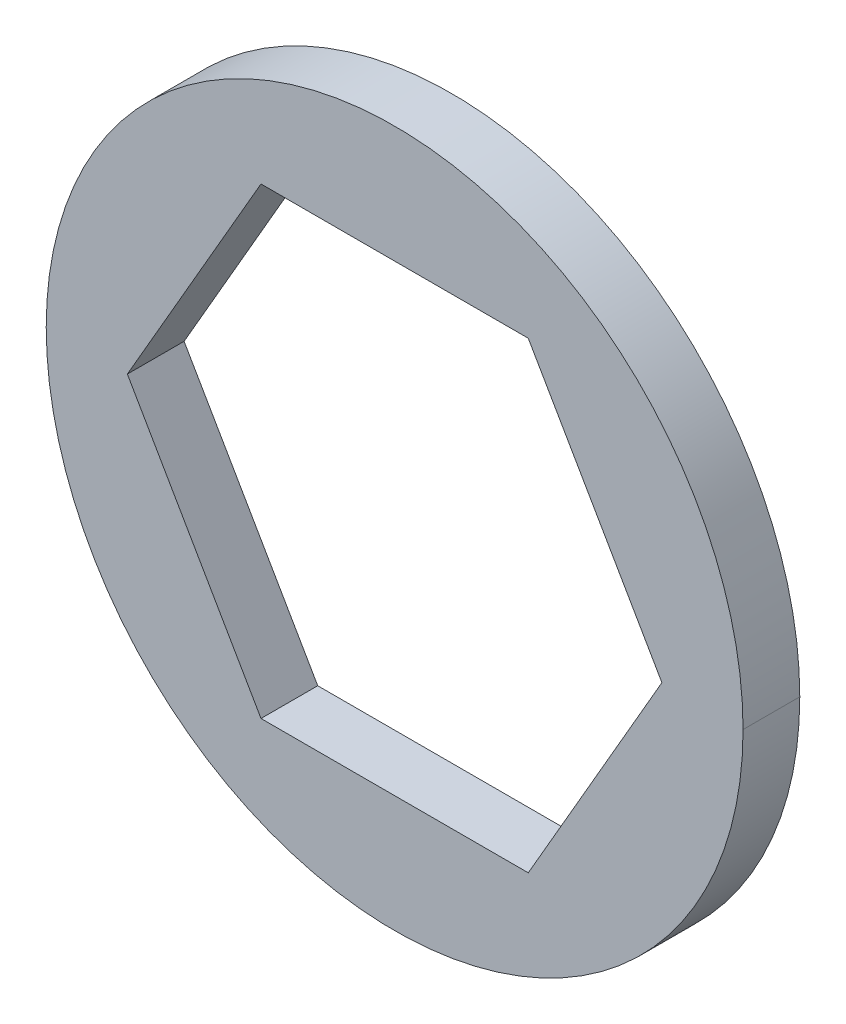
ISO-10303-21;
HEADER;
FILE_DESCRIPTION(('STEP AP214'),'2;1');
FILE_NAME('part.step','',(''),(''),'','','');
FILE_SCHEMA(('AUTOMOTIVE_DESIGN { 1 0 10303 214 1 1 1 1 }'));
ENDSEC;
DATA;
#1=APPLICATION_CONTEXT('core data for automotive mechanical design processes');
#2=APPLICATION_PROTOCOL_DEFINITION('international standard','automotive_design',2000,#1);
#3=PRODUCT_CONTEXT('',#1,'mechanical');
#4=PRODUCT('Part','Part','',(#3));
#5=PRODUCT_RELATED_PRODUCT_CATEGORY('part','',(#4));
#6=PRODUCT_DEFINITION_FORMATION('','',#4);
#7=PRODUCT_DEFINITION_CONTEXT('part definition',#1,'design');
#8=PRODUCT_DEFINITION('design','',#6,#7);
#9=PRODUCT_DEFINITION_SHAPE('','',#8);
#10=(LENGTH_UNIT() NAMED_UNIT(*) SI_UNIT(.MILLI.,.METRE.));
#11=(NAMED_UNIT(*) PLANE_ANGLE_UNIT() SI_UNIT($,.RADIAN.));
#12=(NAMED_UNIT(*) SI_UNIT($,.STERADIAN.) SOLID_ANGLE_UNIT());
#13=UNCERTAINTY_MEASURE_WITH_UNIT(LENGTH_MEASURE(1.E-05),#10,'distance_accuracy_value','');
#14=(GEOMETRIC_REPRESENTATION_CONTEXT(3) GLOBAL_UNCERTAINTY_ASSIGNED_CONTEXT((#13)) GLOBAL_UNIT_ASSIGNED_CONTEXT((#10,
#11,#12)) REPRESENTATION_CONTEXT('',''));
#15=CARTESIAN_POINT('',(0.,0.,0.));
#16=DIRECTION('',(0.,0.,1.));
#17=DIRECTION('',(1.,0.,0.));
#18=AXIS2_PLACEMENT_3D('',#15,#16,#17);
#19=CARTESIAN_POINT('',(-7.47899538708241,0.,0.79375));
#20=DIRECTION('',(0.866025403784439,0.5,0.));
#21=DIRECTION('',(0.,0.,-1.));
#22=AXIS2_PLACEMENT_3D('',#19,#20,#21);
#23=PLANE('',#22);
#24=DIRECTION('',(0.5,-0.866025403784439,0.));
#25=VECTOR('',#24,1.);
#26=CARTESIAN_POINT('',(-7.47899538708241,0.,-0.79375));
#27=LINE('',#26,#25);
#28=CARTESIAN_POINT('',(-7.47899538708241,0.,-0.79375));
#29=VERTEX_POINT('',#28);
#30=CARTESIAN_POINT('',(-3.7394976935412,-6.477,-0.79375));
#31=VERTEX_POINT('',#30);
#32=EDGE_CURVE('E139',#29,#31,#27,.T.);
#33=ORIENTED_EDGE('',*,*,#32,.F.);
#34=DIRECTION('',(0.,0.,-1.));
#35=VECTOR('',#34,1.);
#36=CARTESIAN_POINT('',(-7.47899538708241,0.,0.79375));
#37=LINE('',#36,#35);
#38=CARTESIAN_POINT('',(-7.47899538708242,0.,0.79375));
#39=VERTEX_POINT('',#38);
#40=EDGE_CURVE('E11',#39,#29,#37,.T.);
#41=ORIENTED_EDGE('',*,*,#40,.F.);
#42=DIRECTION('',(0.5,-0.866025403784439,0.));
#43=VECTOR('',#42,1.);
#44=CARTESIAN_POINT('',(-7.47899538708241,0.,0.79375));
#45=LINE('',#44,#43);
#46=CARTESIAN_POINT('',(-3.7394976935412,-6.477,0.79375));
#47=VERTEX_POINT('',#46);
#48=EDGE_CURVE('E129',#39,#47,#45,.T.);
#49=ORIENTED_EDGE('',*,*,#48,.T.);
#50=DIRECTION('',(0.,0.,-1.));
#51=VECTOR('',#50,1.);
#52=CARTESIAN_POINT('',(-3.7394976935412,-6.477,0.79375));
#53=LINE('',#52,#51);
#54=EDGE_CURVE('E136',#47,#31,#53,.T.);
#55=ORIENTED_EDGE('',*,*,#54,.T.);
#56=EDGE_LOOP('',(#33,#41,#49,#55));
#57=FACE_BOUND('',#56,.T.);
#58=ADVANCED_FACE('F16',(#57),#23,.T.);
#59=CARTESIAN_POINT('',(-3.73949769354121,6.477,0.79375));
#60=DIRECTION('',(0.866025403784439,-0.5,0.));
#61=DIRECTION('',(0.,0.,-1.));
#62=AXIS2_PLACEMENT_3D('',#59,#60,#61);
#63=PLANE('',#62);
#64=DIRECTION('',(-0.5,-0.866025403784439,0.));
#65=VECTOR('',#64,1.);
#66=CARTESIAN_POINT('',(-3.73949769354121,6.477,-0.79375));
#67=LINE('',#66,#65);
#68=CARTESIAN_POINT('',(-3.73949769354121,6.477,-0.79375));
#69=VERTEX_POINT('',#68);
#70=EDGE_CURVE('E150',#69,#29,#67,.T.);
#71=ORIENTED_EDGE('',*,*,#70,.F.);
#72=DIRECTION('',(0.,0.,-1.));
#73=VECTOR('',#72,1.);
#74=CARTESIAN_POINT('',(-3.73949769354121,6.477,0.79375));
#75=LINE('',#74,#73);
#76=CARTESIAN_POINT('',(-3.73949769354121,6.477,0.79375));
#77=VERTEX_POINT('',#76);
#78=EDGE_CURVE('E27',#77,#69,#75,.T.);
#79=ORIENTED_EDGE('',*,*,#78,.F.);
#80=DIRECTION('',(-0.5,-0.866025403784439,0.));
#81=VECTOR('',#80,1.);
#82=CARTESIAN_POINT('',(-3.73949769354121,6.477,0.79375));
#83=LINE('',#82,#81);
#84=EDGE_CURVE('E154',#77,#39,#83,.T.);
#85=ORIENTED_EDGE('',*,*,#84,.T.);
#86=ORIENTED_EDGE('',*,*,#40,.T.);
#87=EDGE_LOOP('',(#71,#79,#85,#86));
#88=FACE_BOUND('',#87,.T.);
#89=ADVANCED_FACE('F295',(#88),#63,.T.);
#90=CARTESIAN_POINT('',(3.7394976935412,6.477,0.79375));
#91=DIRECTION('',(0.,-1.,0.));
#92=DIRECTION('',(0.,0.,-1.));
#93=AXIS2_PLACEMENT_3D('',#90,#91,#92);
#94=PLANE('',#93);
#95=DIRECTION('',(-1.,0.,0.));
#96=VECTOR('',#95,1.);
#97=CARTESIAN_POINT('',(3.7394976935412,6.477,-0.79375));
#98=LINE('',#97,#96);
#99=CARTESIAN_POINT('',(3.7394976935412,6.477,-0.79375));
#100=VERTEX_POINT('',#99);
#101=EDGE_CURVE('E142',#100,#69,#98,.T.);
#102=ORIENTED_EDGE('',*,*,#101,.F.);
#103=DIRECTION('',(0.,0.,-1.));
#104=VECTOR('',#103,1.);
#105=CARTESIAN_POINT('',(3.7394976935412,6.477,0.79375));
#106=LINE('',#105,#104);
#107=CARTESIAN_POINT('',(3.7394976935412,6.477,0.79375));
#108=VERTEX_POINT('',#107);
#109=EDGE_CURVE('E107',#108,#100,#106,.T.);
#110=ORIENTED_EDGE('',*,*,#109,.F.);
#111=DIRECTION('',(-1.,0.,0.));
#112=VECTOR('',#111,1.);
#113=CARTESIAN_POINT('',(3.7394976935412,6.477,0.79375));
#114=LINE('',#113,#112);
#115=EDGE_CURVE('E116',#108,#77,#114,.T.);
#116=ORIENTED_EDGE('',*,*,#115,.T.);
#117=ORIENTED_EDGE('',*,*,#78,.T.);
#118=EDGE_LOOP('',(#102,#110,#116,#117));
#119=FACE_BOUND('',#118,.T.);
#120=ADVANCED_FACE('F178',(#119),#94,.T.);
#121=CARTESIAN_POINT('',(7.47899538708241,0.,0.79375));
#122=DIRECTION('',(-0.866025403784439,-0.5,0.));
#123=DIRECTION('',(-0.5,0.866025403784439,0.));
#124=AXIS2_PLACEMENT_3D('',#121,#122,#123);
#125=PLANE('',#124);
#126=DIRECTION('',(-0.5,0.866025403784439,0.));
#127=VECTOR('',#126,1.);
#128=CARTESIAN_POINT('',(7.47899538708241,0.,-0.79375));
#129=LINE('',#128,#127);
#130=CARTESIAN_POINT('',(7.47899538708241,0.,-0.79375));
#131=VERTEX_POINT('',#130);
#132=EDGE_CURVE('E104',#131,#100,#129,.T.);
#133=ORIENTED_EDGE('',*,*,#132,.F.);
#134=DIRECTION('',(0.,0.,-1.));
#135=VECTOR('',#134,1.);
#136=CARTESIAN_POINT('',(7.47899538708241,0.,0.79375));
#137=LINE('',#136,#135);
#138=CARTESIAN_POINT('',(7.47899538708241,0.,0.79375));
#139=VERTEX_POINT('',#138);
#140=EDGE_CURVE('E98',#139,#131,#137,.T.);
#141=ORIENTED_EDGE('',*,*,#140,.F.);
#142=DIRECTION('',(-0.5,0.866025403784439,0.));
#143=VECTOR('',#142,1.);
#144=CARTESIAN_POINT('',(7.47899538708241,0.,0.79375));
#145=LINE('',#144,#143);
#146=EDGE_CURVE('E20',#139,#108,#145,.T.);
#147=ORIENTED_EDGE('',*,*,#146,.T.);
#148=ORIENTED_EDGE('',*,*,#109,.T.);
#149=EDGE_LOOP('',(#133,#141,#147,#148));
#150=FACE_BOUND('',#149,.T.);
#151=ADVANCED_FACE('F100',(#150),#125,.T.);
#152=CARTESIAN_POINT('',(3.73949769354121,-6.477,0.79375));
#153=DIRECTION('',(-0.866025403784439,0.5,0.));
#154=DIRECTION('',(0.,0.,1.));
#155=AXIS2_PLACEMENT_3D('',#152,#153,#154);
#156=PLANE('',#155);
#157=DIRECTION('',(0.5,0.866025403784439,0.));
#158=VECTOR('',#157,1.);
#159=CARTESIAN_POINT('',(3.73949769354121,-6.477,-0.79375));
#160=LINE('',#159,#158);
#161=CARTESIAN_POINT('',(3.73949769354121,-6.477,-0.79375));
#162=VERTEX_POINT('',#161);
#163=EDGE_CURVE('E143',#162,#131,#160,.T.);
#164=ORIENTED_EDGE('',*,*,#163,.F.);
#165=DIRECTION('',(0.,0.,-1.));
#166=VECTOR('',#165,1.);
#167=CARTESIAN_POINT('',(3.73949769354121,-6.477,0.79375));
#168=LINE('',#167,#166);
#169=CARTESIAN_POINT('',(3.73949769354121,-6.477,0.79375));
#170=VERTEX_POINT('',#169);
#171=EDGE_CURVE('E89',#170,#162,#168,.T.);
#172=ORIENTED_EDGE('',*,*,#171,.F.);
#173=DIRECTION('',(0.5,0.866025403784439,0.));
#174=VECTOR('',#173,1.);
#175=CARTESIAN_POINT('',(3.73949769354121,-6.477,0.79375));
#176=LINE('',#175,#174);
#177=EDGE_CURVE('E113',#170,#139,#176,.T.);
#178=ORIENTED_EDGE('',*,*,#177,.T.);
#179=ORIENTED_EDGE('',*,*,#140,.T.);
#180=EDGE_LOOP('',(#164,#172,#178,#179));
#181=FACE_BOUND('',#180,.T.);
#182=ADVANCED_FACE('F119',(#181),#156,.T.);
#183=CARTESIAN_POINT('',(-3.7394976935412,-6.477,0.79375));
#184=DIRECTION('',(0.,1.,0.));
#185=DIRECTION('',(1.,0.,0.));
#186=AXIS2_PLACEMENT_3D('',#183,#184,#185);
#187=PLANE('',#186);
#188=DIRECTION('',(1.,0.,0.));
#189=VECTOR('',#188,1.);
#190=CARTESIAN_POINT('',(-3.7394976935412,-6.477,-0.79375));
#191=LINE('',#190,#189);
#192=EDGE_CURVE('E146',#31,#162,#191,.T.);
#193=ORIENTED_EDGE('',*,*,#192,.F.);
#194=ORIENTED_EDGE('',*,*,#54,.F.);
#195=DIRECTION('',(1.,0.,0.));
#196=VECTOR('',#195,1.);
#197=CARTESIAN_POINT('',(-3.7394976935412,-6.477,0.79375));
#198=LINE('',#197,#196);
#199=EDGE_CURVE('E121',#47,#170,#198,.T.);
#200=ORIENTED_EDGE('',*,*,#199,.T.);
#201=ORIENTED_EDGE('',*,*,#171,.T.);
#202=EDGE_LOOP('',(#193,#194,#200,#201));
#203=FACE_BOUND('',#202,.T.);
#204=ADVANCED_FACE('F307',(#203),#187,.T.);
#205=CARTESIAN_POINT('',(0.,0.,0.79375));
#206=DIRECTION('',(0.,0.,-1.));
#207=DIRECTION('',(-1.,0.,0.));
#208=AXIS2_PLACEMENT_3D('',#205,#206,#207);
#209=CYLINDRICAL_SURFACE('',#208,9.75);
#210=DIRECTION('',(0.,0.,-1.));
#211=VECTOR('',#210,1.);
#212=CARTESIAN_POINT('',(9.75,0.,0.79375));
#213=LINE('',#212,#211);
#214=CARTESIAN_POINT('',(9.75,0.,0.79375));
#215=VERTEX_POINT('',#214);
#216=CARTESIAN_POINT('',(9.75,0.,-0.79375));
#217=VERTEX_POINT('',#216);
#218=EDGE_CURVE('E162',#215,#217,#213,.T.);
#219=ORIENTED_EDGE('',*,*,#218,.F.);
#220=CARTESIAN_POINT('',(0.,0.,0.79375));
#221=DIRECTION('',(0.,0.,1.));
#222=DIRECTION('',(1.,0.,0.));
#223=AXIS2_PLACEMENT_3D('',#220,#221,#222);
#224=CIRCLE('',#223,9.75);
#225=CARTESIAN_POINT('',(-9.75,0.,0.79375));
#226=VERTEX_POINT('',#225);
#227=EDGE_CURVE('E122',#226,#215,#224,.T.);
#228=ORIENTED_EDGE('',*,*,#227,.F.);
#229=DIRECTION('',(0.,0.,-1.));
#230=VECTOR('',#229,1.);
#231=CARTESIAN_POINT('',(-9.75,0.,0.79375));
#232=LINE('',#231,#230);
#233=CARTESIAN_POINT('',(-9.75,0.,-0.79375));
#234=VERTEX_POINT('',#233);
#235=EDGE_CURVE('E131',#226,#234,#232,.T.);
#236=ORIENTED_EDGE('',*,*,#235,.T.);
#237=CARTESIAN_POINT('',(0.,0.,-0.79375));
#238=DIRECTION('',(0.,0.,1.));
#239=DIRECTION('',(1.,0.,0.));
#240=AXIS2_PLACEMENT_3D('',#237,#238,#239);
#241=CIRCLE('',#240,9.75);
#242=EDGE_CURVE('E118',#234,#217,#241,.T.);
#243=ORIENTED_EDGE('',*,*,#242,.T.);
#244=EDGE_LOOP('',(#219,#228,#236,#243));
#245=FACE_BOUND('',#244,.T.);
#246=ADVANCED_FACE('F314',(#245),#209,.T.);
#247=CARTESIAN_POINT('',(0.,0.,-0.79375));
#248=DIRECTION('',(0.,0.,1.));
#249=DIRECTION('',(1.,0.,0.));
#250=AXIS2_PLACEMENT_3D('',#247,#248,#249);
#251=PLANE('',#250);
#252=ORIENTED_EDGE('',*,*,#192,.T.);
#253=ORIENTED_EDGE('',*,*,#163,.T.);
#254=ORIENTED_EDGE('',*,*,#132,.T.);
#255=ORIENTED_EDGE('',*,*,#101,.T.);
#256=ORIENTED_EDGE('',*,*,#70,.T.);
#257=ORIENTED_EDGE('',*,*,#32,.T.);
#258=EDGE_LOOP('',(#252,#253,#254,#255,#256,#257));
#259=FACE_BOUND('',#258,.T.);
#260=ORIENTED_EDGE('',*,*,#242,.F.);
#261=CARTESIAN_POINT('',(0.,0.,-0.79375));
#262=DIRECTION('',(0.,0.,1.));
#263=DIRECTION('',(1.,0.,0.));
#264=AXIS2_PLACEMENT_3D('',#261,#262,#263);
#265=CIRCLE('',#264,9.75);
#266=EDGE_CURVE('E436',#217,#234,#265,.T.);
#267=ORIENTED_EDGE('',*,*,#266,.F.);
#268=EDGE_LOOP('',(#260,#267));
#269=FACE_BOUND('',#268,.T.);
#270=ADVANCED_FACE('F174',(#259,#269),#251,.F.);
#271=CARTESIAN_POINT('',(0.,0.,0.79375));
#272=DIRECTION('',(0.,0.,1.));
#273=DIRECTION('',(1.,0.,0.));
#274=AXIS2_PLACEMENT_3D('',#271,#272,#273);
#275=PLANE('',#274);
#276=ORIENTED_EDGE('',*,*,#177,.F.);
#277=ORIENTED_EDGE('',*,*,#199,.F.);
#278=ORIENTED_EDGE('',*,*,#48,.F.);
#279=ORIENTED_EDGE('',*,*,#84,.F.);
#280=ORIENTED_EDGE('',*,*,#115,.F.);
#281=ORIENTED_EDGE('',*,*,#146,.F.);
#282=EDGE_LOOP('',(#276,#277,#278,#279,#280,#281));
#283=FACE_BOUND('',#282,.T.);
#284=ORIENTED_EDGE('',*,*,#227,.T.);
#285=CARTESIAN_POINT('',(0.,0.,0.79375));
#286=DIRECTION('',(0.,0.,1.));
#287=DIRECTION('',(1.,0.,0.));
#288=AXIS2_PLACEMENT_3D('',#285,#286,#287);
#289=CIRCLE('',#288,9.75);
#290=EDGE_CURVE('E158',#215,#226,#289,.T.);
#291=ORIENTED_EDGE('',*,*,#290,.T.);
#292=EDGE_LOOP('',(#284,#291));
#293=FACE_BOUND('',#292,.T.);
#294=ADVANCED_FACE('F18',(#283,#293),#275,.T.);
#295=CARTESIAN_POINT('',(0.,0.,0.79375));
#296=DIRECTION('',(0.,0.,-1.));
#297=DIRECTION('',(-1.,0.,0.));
#298=AXIS2_PLACEMENT_3D('',#295,#296,#297);
#299=CYLINDRICAL_SURFACE('',#298,9.75);
#300=ORIENTED_EDGE('',*,*,#290,.F.);
#301=ORIENTED_EDGE('',*,*,#218,.T.);
#302=ORIENTED_EDGE('',*,*,#266,.T.);
#303=ORIENTED_EDGE('',*,*,#235,.F.);
#304=EDGE_LOOP('',(#300,#301,#302,#303));
#305=FACE_BOUND('',#304,.T.);
#306=ADVANCED_FACE('F289',(#305),#299,.T.);
#307=CLOSED_SHELL('',(#58,#89,#120,#151,#182,#204,#246,#270,#294,#306));
#308=MANIFOLD_SOLID_BREP('B1',#307);
#309=ADVANCED_BREP_SHAPE_REPRESENTATION('',(#18,#308),#14);
#310=SHAPE_DEFINITION_REPRESENTATION(#9,#309);
ENDSEC;
END-ISO-10303-21;
